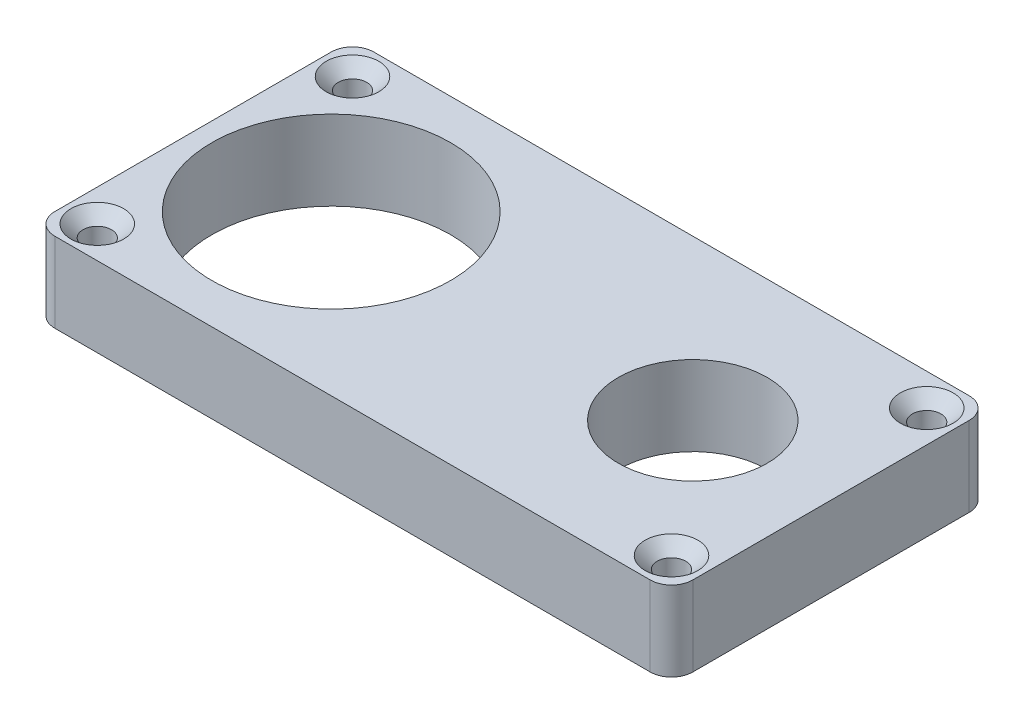
ISO-10303-21;
HEADER;
FILE_DESCRIPTION(('STEP AP214'),'2;1');
FILE_NAME('part.step','',(''),(''),'','','');
FILE_SCHEMA(('AUTOMOTIVE_DESIGN { 1 0 10303 214 1 1 1 1 }'));
ENDSEC;
DATA;
#1=APPLICATION_CONTEXT('core data for automotive mechanical design processes');
#2=APPLICATION_PROTOCOL_DEFINITION('international standard','automotive_design',2000,#1);
#3=PRODUCT_CONTEXT('',#1,'mechanical');
#4=PRODUCT('Part','Part','',(#3));
#5=PRODUCT_RELATED_PRODUCT_CATEGORY('part','',(#4));
#6=PRODUCT_DEFINITION_FORMATION('','',#4);
#7=PRODUCT_DEFINITION_CONTEXT('part definition',#1,'design');
#8=PRODUCT_DEFINITION('design','',#6,#7);
#9=PRODUCT_DEFINITION_SHAPE('','',#8);
#10=(LENGTH_UNIT() NAMED_UNIT(*) SI_UNIT(.MILLI.,.METRE.));
#11=(NAMED_UNIT(*) PLANE_ANGLE_UNIT() SI_UNIT($,.RADIAN.));
#12=(NAMED_UNIT(*) SI_UNIT($,.STERADIAN.) SOLID_ANGLE_UNIT());
#13=UNCERTAINTY_MEASURE_WITH_UNIT(LENGTH_MEASURE(1.E-05),#10,'distance_accuracy_value','');
#14=(GEOMETRIC_REPRESENTATION_CONTEXT(3) GLOBAL_UNCERTAINTY_ASSIGNED_CONTEXT((#13)) GLOBAL_UNIT_ASSIGNED_CONTEXT((#10,
#11,#12)) REPRESENTATION_CONTEXT('',''));
#15=CARTESIAN_POINT('',(0.,0.,0.));
#16=DIRECTION('',(0.,0.,1.));
#17=DIRECTION('',(1.,0.,0.));
#18=AXIS2_PLACEMENT_3D('',#15,#16,#17);
#19=CARTESIAN_POINT('',(-35.56,9.525,-16.51));
#20=DIRECTION('',(0.,-1.,0.));
#21=DIRECTION('',(0.,0.,-1.));
#22=AXIS2_PLACEMENT_3D('',#19,#20,#21);
#23=CYLINDRICAL_SURFACE('',#22,2.54);
#24=CARTESIAN_POINT('',(-35.56,0.,-16.51));
#25=DIRECTION('',(0.,-1.,0.));
#26=DIRECTION('',(0.,0.,-1.));
#27=AXIS2_PLACEMENT_3D('',#24,#25,#26);
#28=CIRCLE('',#27,2.54);
#29=CARTESIAN_POINT('',(-38.1,0.,-16.51));
#30=VERTEX_POINT('',#29);
#31=CARTESIAN_POINT('',(-35.56,0.,-19.05));
#32=VERTEX_POINT('',#31);
#33=EDGE_CURVE('E130',#30,#32,#28,.T.);
#34=ORIENTED_EDGE('',*,*,#33,.F.);
#35=DIRECTION('',(0.,-1.,0.));
#36=VECTOR('',#35,1.);
#37=CARTESIAN_POINT('',(-38.1,9.525,-16.51));
#38=LINE('',#37,#36);
#39=CARTESIAN_POINT('',(-38.1,9.525,-16.51));
#40=VERTEX_POINT('',#39);
#41=EDGE_CURVE('E11',#40,#30,#38,.T.);
#42=ORIENTED_EDGE('',*,*,#41,.F.);
#43=CARTESIAN_POINT('',(-35.56,9.525,-16.51));
#44=DIRECTION('',(0.,-1.,0.));
#45=DIRECTION('',(0.,0.,-1.));
#46=AXIS2_PLACEMENT_3D('',#43,#44,#45);
#47=CIRCLE('',#46,2.54);
#48=CARTESIAN_POINT('',(-35.56,9.525,-19.05));
#49=VERTEX_POINT('',#48);
#50=EDGE_CURVE('E151',#40,#49,#47,.T.);
#51=ORIENTED_EDGE('',*,*,#50,.T.);
#52=DIRECTION('',(0.,-1.,0.));
#53=VECTOR('',#52,1.);
#54=CARTESIAN_POINT('',(-35.56,9.525,-19.05));
#55=LINE('',#54,#53);
#56=EDGE_CURVE('E88',#49,#32,#55,.T.);
#57=ORIENTED_EDGE('',*,*,#56,.T.);
#58=EDGE_LOOP('',(#34,#42,#51,#57));
#59=FACE_BOUND('',#58,.T.);
#60=ADVANCED_FACE('F32',(#59),#23,.T.);
#61=CARTESIAN_POINT('',(-38.1,9.525,16.51));
#62=DIRECTION('',(-1.,0.,0.));
#63=DIRECTION('',(0.,0.,1.));
#64=AXIS2_PLACEMENT_3D('',#61,#62,#63);
#65=PLANE('',#64);
#66=DIRECTION('',(0.,0.,-1.));
#67=VECTOR('',#66,1.);
#68=CARTESIAN_POINT('',(-38.1,0.,16.51));
#69=LINE('',#68,#67);
#70=CARTESIAN_POINT('',(-38.1,0.,16.51));
#71=VERTEX_POINT('',#70);
#72=EDGE_CURVE('E149',#71,#30,#69,.T.);
#73=ORIENTED_EDGE('',*,*,#72,.F.);
#74=DIRECTION('',(0.,-1.,0.));
#75=VECTOR('',#74,1.);
#76=CARTESIAN_POINT('',(-38.1,9.525,16.51));
#77=LINE('',#76,#75);
#78=CARTESIAN_POINT('',(-38.1,9.525,16.51));
#79=VERTEX_POINT('',#78);
#80=EDGE_CURVE('E41',#79,#71,#77,.T.);
#81=ORIENTED_EDGE('',*,*,#80,.F.);
#82=DIRECTION('',(0.,0.,-1.));
#83=VECTOR('',#82,1.);
#84=CARTESIAN_POINT('',(-38.1,9.525,16.51));
#85=LINE('',#84,#83);
#86=EDGE_CURVE('E120',#79,#40,#85,.T.);
#87=ORIENTED_EDGE('',*,*,#86,.T.);
#88=ORIENTED_EDGE('',*,*,#41,.T.);
#89=EDGE_LOOP('',(#73,#81,#87,#88));
#90=FACE_BOUND('',#89,.T.);
#91=ADVANCED_FACE('F222',(#90),#65,.T.);
#92=CARTESIAN_POINT('',(-35.56,9.525,16.51));
#93=DIRECTION('',(0.,-1.,0.));
#94=DIRECTION('',(0.,0.,-1.));
#95=AXIS2_PLACEMENT_3D('',#92,#93,#94);
#96=CYLINDRICAL_SURFACE('',#95,2.54);
#97=CARTESIAN_POINT('',(-35.56,0.,16.51));
#98=DIRECTION('',(0.,-1.,0.));
#99=DIRECTION('',(0.,0.,-1.));
#100=AXIS2_PLACEMENT_3D('',#97,#98,#99);
#101=CIRCLE('',#100,2.54);
#102=CARTESIAN_POINT('',(-35.56,0.,19.05));
#103=VERTEX_POINT('',#102);
#104=EDGE_CURVE('E107',#103,#71,#101,.T.);
#105=ORIENTED_EDGE('',*,*,#104,.F.);
#106=DIRECTION('',(0.,-1.,0.));
#107=VECTOR('',#106,1.);
#108=CARTESIAN_POINT('',(-35.56,9.525,19.05));
#109=LINE('',#108,#107);
#110=CARTESIAN_POINT('',(-35.56,9.525,19.05));
#111=VERTEX_POINT('',#110);
#112=EDGE_CURVE('E102',#111,#103,#109,.T.);
#113=ORIENTED_EDGE('',*,*,#112,.F.);
#114=CARTESIAN_POINT('',(-35.56,9.525,16.51));
#115=DIRECTION('',(0.,-1.,0.));
#116=DIRECTION('',(0.,0.,-1.));
#117=AXIS2_PLACEMENT_3D('',#114,#115,#116);
#118=CIRCLE('',#117,2.54);
#119=EDGE_CURVE('E105',#111,#79,#118,.T.);
#120=ORIENTED_EDGE('',*,*,#119,.T.);
#121=ORIENTED_EDGE('',*,*,#80,.T.);
#122=EDGE_LOOP('',(#105,#113,#120,#121));
#123=FACE_BOUND('',#122,.T.);
#124=ADVANCED_FACE('F104',(#123),#96,.T.);
#125=CARTESIAN_POINT('',(35.56,9.525,19.05));
#126=DIRECTION('',(0.,0.,1.));
#127=DIRECTION('',(1.,0.,0.));
#128=AXIS2_PLACEMENT_3D('',#125,#126,#127);
#129=PLANE('',#128);
#130=DIRECTION('',(-1.,0.,0.));
#131=VECTOR('',#130,1.);
#132=CARTESIAN_POINT('',(35.56,0.,19.05));
#133=LINE('',#132,#131);
#134=CARTESIAN_POINT('',(35.56,0.,19.05));
#135=VERTEX_POINT('',#134);
#136=EDGE_CURVE('E146',#135,#103,#133,.T.);
#137=ORIENTED_EDGE('',*,*,#136,.F.);
#138=DIRECTION('',(0.,-1.,0.));
#139=VECTOR('',#138,1.);
#140=CARTESIAN_POINT('',(35.56,9.525,19.05));
#141=LINE('',#140,#139);
#142=CARTESIAN_POINT('',(35.56,9.525,19.05));
#143=VERTEX_POINT('',#142);
#144=EDGE_CURVE('E112',#143,#135,#141,.T.);
#145=ORIENTED_EDGE('',*,*,#144,.F.);
#146=DIRECTION('',(-1.,0.,0.));
#147=VECTOR('',#146,1.);
#148=CARTESIAN_POINT('',(35.56,9.525,19.05));
#149=LINE('',#148,#147);
#150=EDGE_CURVE('E118',#143,#111,#149,.T.);
#151=ORIENTED_EDGE('',*,*,#150,.T.);
#152=ORIENTED_EDGE('',*,*,#112,.T.);
#153=EDGE_LOOP('',(#137,#145,#151,#152));
#154=FACE_BOUND('',#153,.T.);
#155=ADVANCED_FACE('F122',(#154),#129,.T.);
#156=CARTESIAN_POINT('',(35.56,9.525,16.51));
#157=DIRECTION('',(0.,-1.,0.));
#158=DIRECTION('',(0.,0.,-1.));
#159=AXIS2_PLACEMENT_3D('',#156,#157,#158);
#160=CYLINDRICAL_SURFACE('',#159,2.54);
#161=CARTESIAN_POINT('',(35.56,0.,16.51));
#162=DIRECTION('',(0.,-1.,0.));
#163=DIRECTION('',(0.,0.,-1.));
#164=AXIS2_PLACEMENT_3D('',#161,#162,#163);
#165=CIRCLE('',#164,2.54);
#166=CARTESIAN_POINT('',(38.1,0.,16.51));
#167=VERTEX_POINT('',#166);
#168=EDGE_CURVE('E143',#167,#135,#165,.T.);
#169=ORIENTED_EDGE('',*,*,#168,.F.);
#170=DIRECTION('',(0.,-1.,0.));
#171=VECTOR('',#170,1.);
#172=CARTESIAN_POINT('',(38.1,9.525,16.51));
#173=LINE('',#172,#171);
#174=CARTESIAN_POINT('',(38.1,9.525,16.51));
#175=VERTEX_POINT('',#174);
#176=EDGE_CURVE('E155',#175,#167,#173,.T.);
#177=ORIENTED_EDGE('',*,*,#176,.F.);
#178=CARTESIAN_POINT('',(35.56,9.525,16.51));
#179=DIRECTION('',(0.,-1.,0.));
#180=DIRECTION('',(0.,0.,-1.));
#181=AXIS2_PLACEMENT_3D('',#178,#179,#180);
#182=CIRCLE('',#181,2.54);
#183=EDGE_CURVE('E123',#175,#143,#182,.T.);
#184=ORIENTED_EDGE('',*,*,#183,.T.);
#185=ORIENTED_EDGE('',*,*,#144,.T.);
#186=EDGE_LOOP('',(#169,#177,#184,#185));
#187=FACE_BOUND('',#186,.T.);
#188=ADVANCED_FACE('F235',(#187),#160,.T.);
#189=CARTESIAN_POINT('',(38.1,9.525,-16.51));
#190=DIRECTION('',(1.,0.,0.));
#191=DIRECTION('',(0.,0.,-1.));
#192=AXIS2_PLACEMENT_3D('',#189,#190,#191);
#193=PLANE('',#192);
#194=DIRECTION('',(0.,0.,1.));
#195=VECTOR('',#194,1.);
#196=CARTESIAN_POINT('',(38.1,0.,-16.51));
#197=LINE('',#196,#195);
#198=CARTESIAN_POINT('',(38.1,0.,-16.51));
#199=VERTEX_POINT('',#198);
#200=EDGE_CURVE('E140',#199,#167,#197,.T.);
#201=ORIENTED_EDGE('',*,*,#200,.F.);
#202=DIRECTION('',(0.,-1.,0.));
#203=VECTOR('',#202,1.);
#204=CARTESIAN_POINT('',(38.1,9.525,-16.51));
#205=LINE('',#204,#203);
#206=CARTESIAN_POINT('',(38.1,9.525,-16.51));
#207=VERTEX_POINT('',#206);
#208=EDGE_CURVE('E157',#207,#199,#205,.T.);
#209=ORIENTED_EDGE('',*,*,#208,.F.);
#210=DIRECTION('',(0.,0.,1.));
#211=VECTOR('',#210,1.);
#212=CARTESIAN_POINT('',(38.1,9.525,-16.51));
#213=LINE('',#212,#211);
#214=EDGE_CURVE('E125',#207,#175,#213,.T.);
#215=ORIENTED_EDGE('',*,*,#214,.T.);
#216=ORIENTED_EDGE('',*,*,#176,.T.);
#217=EDGE_LOOP('',(#201,#209,#215,#216));
#218=FACE_BOUND('',#217,.T.);
#219=ADVANCED_FACE('F213',(#218),#193,.T.);
#220=CARTESIAN_POINT('',(35.56,9.525,-16.51));
#221=DIRECTION('',(0.,-1.,0.));
#222=DIRECTION('',(0.,0.,-1.));
#223=AXIS2_PLACEMENT_3D('',#220,#221,#222);
#224=CYLINDRICAL_SURFACE('',#223,2.54);
#225=CARTESIAN_POINT('',(35.56,0.,-16.51));
#226=DIRECTION('',(0.,-1.,0.));
#227=DIRECTION('',(0.,0.,-1.));
#228=AXIS2_PLACEMENT_3D('',#225,#226,#227);
#229=CIRCLE('',#228,2.54);
#230=CARTESIAN_POINT('',(35.56,0.,-19.05));
#231=VERTEX_POINT('',#230);
#232=EDGE_CURVE('E137',#231,#199,#229,.T.);
#233=ORIENTED_EDGE('',*,*,#232,.F.);
#234=DIRECTION('',(0.,-1.,0.));
#235=VECTOR('',#234,1.);
#236=CARTESIAN_POINT('',(35.56,9.525,-19.05));
#237=LINE('',#236,#235);
#238=CARTESIAN_POINT('',(35.56,9.525,-19.05));
#239=VERTEX_POINT('',#238);
#240=EDGE_CURVE('E159',#239,#231,#237,.T.);
#241=ORIENTED_EDGE('',*,*,#240,.F.);
#242=CARTESIAN_POINT('',(35.56,9.525,-16.51));
#243=DIRECTION('',(0.,-1.,0.));
#244=DIRECTION('',(0.,0.,-1.));
#245=AXIS2_PLACEMENT_3D('',#242,#243,#244);
#246=CIRCLE('',#245,2.54);
#247=EDGE_CURVE('E207',#239,#207,#246,.T.);
#248=ORIENTED_EDGE('',*,*,#247,.T.);
#249=ORIENTED_EDGE('',*,*,#208,.T.);
#250=EDGE_LOOP('',(#233,#241,#248,#249));
#251=FACE_BOUND('',#250,.T.);
#252=ADVANCED_FACE('F218',(#251),#224,.T.);
#253=CARTESIAN_POINT('',(-35.56,9.525,-19.05));
#254=DIRECTION('',(0.,0.,-1.));
#255=DIRECTION('',(-1.,0.,0.));
#256=AXIS2_PLACEMENT_3D('',#253,#254,#255);
#257=PLANE('',#256);
#258=DIRECTION('',(1.,0.,0.));
#259=VECTOR('',#258,1.);
#260=CARTESIAN_POINT('',(-35.56,0.,-19.05));
#261=LINE('',#260,#259);
#262=EDGE_CURVE('E133',#32,#231,#261,.T.);
#263=ORIENTED_EDGE('',*,*,#262,.F.);
#264=ORIENTED_EDGE('',*,*,#56,.F.);
#265=DIRECTION('',(1.,0.,0.));
#266=VECTOR('',#265,1.);
#267=CARTESIAN_POINT('',(-35.56,9.525,-19.05));
#268=LINE('',#267,#266);
#269=EDGE_CURVE('E205',#49,#239,#268,.T.);
#270=ORIENTED_EDGE('',*,*,#269,.T.);
#271=ORIENTED_EDGE('',*,*,#240,.T.);
#272=EDGE_LOOP('',(#263,#264,#270,#271));
#273=FACE_BOUND('',#272,.T.);
#274=ADVANCED_FACE('F219',(#273),#257,.T.);
#275=CARTESIAN_POINT('',(-35.56,9.525,-16.51));
#276=DIRECTION('',(0.,-1.,0.));
#277=DIRECTION('',(0.,0.,-1.));
#278=AXIS2_PLACEMENT_3D('',#275,#276,#277);
#279=PLANE('',#278);
#280=CARTESIAN_POINT('',(-34.29,9.525,-15.24));
#281=DIRECTION('',(0.,1.,0.));
#282=DIRECTION('',(0.,0.,1.));
#283=AXIS2_PLACEMENT_3D('',#280,#281,#282);
#284=CIRCLE('',#283,3.15);
#285=CARTESIAN_POINT('',(-34.29,9.525,-12.09));
#286=VERTEX_POINT('',#285);
#287=EDGE_CURVE('E299',#286,#286,#284,.T.);
#288=ORIENTED_EDGE('',*,*,#287,.F.);
#289=EDGE_LOOP('',(#288));
#290=FACE_BOUND('',#289,.T.);
#291=CARTESIAN_POINT('',(-34.29,9.525,15.24));
#292=DIRECTION('',(0.,1.,0.));
#293=DIRECTION('',(0.,0.,1.));
#294=AXIS2_PLACEMENT_3D('',#291,#292,#293);
#295=CIRCLE('',#294,3.15);
#296=CARTESIAN_POINT('',(-34.29,9.525,18.39));
#297=VERTEX_POINT('',#296);
#298=EDGE_CURVE('E180',#297,#297,#295,.T.);
#299=ORIENTED_EDGE('',*,*,#298,.F.);
#300=EDGE_LOOP('',(#299));
#301=FACE_BOUND('',#300,.T.);
#302=CARTESIAN_POINT('',(34.29,9.525,15.24));
#303=DIRECTION('',(0.,1.,0.));
#304=DIRECTION('',(0.,0.,1.));
#305=AXIS2_PLACEMENT_3D('',#302,#303,#304);
#306=CIRCLE('',#305,3.15);
#307=CARTESIAN_POINT('',(34.29,9.525,18.39));
#308=VERTEX_POINT('',#307);
#309=EDGE_CURVE('E173',#308,#308,#306,.T.);
#310=ORIENTED_EDGE('',*,*,#309,.F.);
#311=EDGE_LOOP('',(#310));
#312=FACE_BOUND('',#311,.T.);
#313=CARTESIAN_POINT('',(34.29,9.525,-15.24));
#314=DIRECTION('',(0.,1.,0.));
#315=DIRECTION('',(0.,0.,1.));
#316=AXIS2_PLACEMENT_3D('',#313,#314,#315);
#317=CIRCLE('',#316,3.15);
#318=CARTESIAN_POINT('',(34.29,9.525,-12.09));
#319=VERTEX_POINT('',#318);
#320=EDGE_CURVE('E169',#319,#319,#317,.T.);
#321=ORIENTED_EDGE('',*,*,#320,.F.);
#322=EDGE_LOOP('',(#321));
#323=FACE_BOUND('',#322,.T.);
#324=CARTESIAN_POINT('',(-21.59,9.525,0.));
#325=DIRECTION('',(0.,-1.,0.));
#326=DIRECTION('',(0.,0.,1.));
#327=AXIS2_PLACEMENT_3D('',#324,#325,#326);
#328=CIRCLE('',#327,14.265);
#329=CARTESIAN_POINT('',(-21.59,9.525,-14.265));
#330=VERTEX_POINT('',#329);
#331=EDGE_CURVE('E194',#330,#330,#328,.T.);
#332=ORIENTED_EDGE('',*,*,#331,.T.);
#333=EDGE_LOOP('',(#332));
#334=FACE_BOUND('',#333,.T.);
#335=CARTESIAN_POINT('',(21.59,9.525,0.));
#336=DIRECTION('',(0.,-1.,0.));
#337=DIRECTION('',(0.,0.,1.));
#338=AXIS2_PLACEMENT_3D('',#335,#336,#337);
#339=CIRCLE('',#338,8.89);
#340=CARTESIAN_POINT('',(21.59,9.525,-8.89));
#341=VERTEX_POINT('',#340);
#342=EDGE_CURVE('E134',#341,#341,#339,.T.);
#343=ORIENTED_EDGE('',*,*,#342,.T.);
#344=EDGE_LOOP('',(#343));
#345=FACE_BOUND('',#344,.T.);
#346=ORIENTED_EDGE('',*,*,#50,.F.);
#347=ORIENTED_EDGE('',*,*,#86,.F.);
#348=ORIENTED_EDGE('',*,*,#119,.F.);
#349=ORIENTED_EDGE('',*,*,#150,.F.);
#350=ORIENTED_EDGE('',*,*,#183,.F.);
#351=ORIENTED_EDGE('',*,*,#214,.F.);
#352=ORIENTED_EDGE('',*,*,#247,.F.);
#353=ORIENTED_EDGE('',*,*,#269,.F.);
#354=EDGE_LOOP('',(#346,#347,#348,#349,#350,#351,#352,#353));
#355=FACE_BOUND('',#354,.T.);
#356=ADVANCED_FACE('F116',(#290,#301,#312,#323,#334,#345,#355),#279,.F.);
#357=CARTESIAN_POINT('',(-35.56,0.,-16.51));
#358=DIRECTION('',(0.,-1.,0.));
#359=DIRECTION('',(0.,0.,-1.));
#360=AXIS2_PLACEMENT_3D('',#357,#358,#359);
#361=PLANE('',#360);
#362=CARTESIAN_POINT('',(-34.29,0.,-15.24));
#363=DIRECTION('',(0.,-1.,0.));
#364=DIRECTION('',(0.,0.,-1.));
#365=AXIS2_PLACEMENT_3D('',#362,#363,#364);
#366=CIRCLE('',#365,1.7);
#367=CARTESIAN_POINT('',(-34.29,0.,-16.94));
#368=VERTEX_POINT('',#367);
#369=EDGE_CURVE('E35',#368,#368,#366,.T.);
#370=ORIENTED_EDGE('',*,*,#369,.F.);
#371=EDGE_LOOP('',(#370));
#372=FACE_BOUND('',#371,.T.);
#373=CARTESIAN_POINT('',(-34.29,0.,15.24));
#374=DIRECTION('',(0.,-1.,0.));
#375=DIRECTION('',(0.,0.,-1.));
#376=AXIS2_PLACEMENT_3D('',#373,#374,#375);
#377=CIRCLE('',#376,1.7);
#378=CARTESIAN_POINT('',(-34.29,0.,13.54));
#379=VERTEX_POINT('',#378);
#380=EDGE_CURVE('E171',#379,#379,#377,.T.);
#381=ORIENTED_EDGE('',*,*,#380,.F.);
#382=EDGE_LOOP('',(#381));
#383=FACE_BOUND('',#382,.T.);
#384=CARTESIAN_POINT('',(34.29,0.,15.24));
#385=DIRECTION('',(0.,-1.,0.));
#386=DIRECTION('',(0.,0.,-1.));
#387=AXIS2_PLACEMENT_3D('',#384,#385,#386);
#388=CIRCLE('',#387,1.7);
#389=CARTESIAN_POINT('',(34.29,0.,13.54));
#390=VERTEX_POINT('',#389);
#391=EDGE_CURVE('E167',#390,#390,#388,.T.);
#392=ORIENTED_EDGE('',*,*,#391,.F.);
#393=EDGE_LOOP('',(#392));
#394=FACE_BOUND('',#393,.T.);
#395=CARTESIAN_POINT('',(34.29,0.,-15.24));
#396=DIRECTION('',(0.,-1.,0.));
#397=DIRECTION('',(0.,0.,-1.));
#398=AXIS2_PLACEMENT_3D('',#395,#396,#397);
#399=CIRCLE('',#398,1.7);
#400=CARTESIAN_POINT('',(34.29,0.,-16.94));
#401=VERTEX_POINT('',#400);
#402=EDGE_CURVE('E162',#401,#401,#399,.T.);
#403=ORIENTED_EDGE('',*,*,#402,.F.);
#404=EDGE_LOOP('',(#403));
#405=FACE_BOUND('',#404,.T.);
#406=CARTESIAN_POINT('',(-21.59,0.,0.));
#407=DIRECTION('',(0.,-1.,0.));
#408=DIRECTION('',(0.,0.,1.));
#409=AXIS2_PLACEMENT_3D('',#406,#407,#408);
#410=CIRCLE('',#409,14.265);
#411=CARTESIAN_POINT('',(-21.59,0.,-14.265));
#412=VERTEX_POINT('',#411);
#413=EDGE_CURVE('E165',#412,#412,#410,.T.);
#414=ORIENTED_EDGE('',*,*,#413,.F.);
#415=EDGE_LOOP('',(#414));
#416=FACE_BOUND('',#415,.T.);
#417=CARTESIAN_POINT('',(21.59,0.,0.));
#418=DIRECTION('',(0.,-1.,0.));
#419=DIRECTION('',(0.,0.,1.));
#420=AXIS2_PLACEMENT_3D('',#417,#418,#419);
#421=CIRCLE('',#420,8.89);
#422=CARTESIAN_POINT('',(21.59,0.,-8.89));
#423=VERTEX_POINT('',#422);
#424=EDGE_CURVE('E197',#423,#423,#421,.T.);
#425=ORIENTED_EDGE('',*,*,#424,.F.);
#426=EDGE_LOOP('',(#425));
#427=FACE_BOUND('',#426,.T.);
#428=ORIENTED_EDGE('',*,*,#33,.T.);
#429=ORIENTED_EDGE('',*,*,#262,.T.);
#430=ORIENTED_EDGE('',*,*,#232,.T.);
#431=ORIENTED_EDGE('',*,*,#200,.T.);
#432=ORIENTED_EDGE('',*,*,#168,.T.);
#433=ORIENTED_EDGE('',*,*,#136,.T.);
#434=ORIENTED_EDGE('',*,*,#104,.T.);
#435=ORIENTED_EDGE('',*,*,#72,.T.);
#436=EDGE_LOOP('',(#428,#429,#430,#431,#432,#433,#434,#435));
#437=FACE_BOUND('',#436,.T.);
#438=ADVANCED_FACE('F221',(#372,#383,#394,#405,#416,#427,#437),#361,.T.);
#439=CARTESIAN_POINT('',(21.59,9.525,0.));
#440=DIRECTION('',(0.,-1.,0.));
#441=DIRECTION('',(0.,0.,-1.));
#442=AXIS2_PLACEMENT_3D('',#439,#440,#441);
#443=CYLINDRICAL_SURFACE('',#442,8.89);
#444=CARTESIAN_POINT('',(21.59,9.525,-8.89));
#445=CARTESIAN_POINT('',(21.59,9.42578125,-8.89));
#446=CARTESIAN_POINT('',(21.59,9.3265625,-8.89));
#447=CARTESIAN_POINT('',(21.59,9.128125,-8.89));
#448=CARTESIAN_POINT('',(21.59,9.02890625,-8.89));
#449=CARTESIAN_POINT('',(21.59,8.83046875,-8.89));
#450=CARTESIAN_POINT('',(21.59,8.73125,-8.89));
#451=CARTESIAN_POINT('',(21.59,8.5328125,-8.89));
#452=CARTESIAN_POINT('',(21.59,8.43359375,-8.89));
#453=CARTESIAN_POINT('',(21.59,8.23515625,-8.89));
#454=CARTESIAN_POINT('',(21.59,8.1359375,-8.89));
#455=CARTESIAN_POINT('',(21.59,7.9375,-8.89));
#456=CARTESIAN_POINT('',(21.59,7.83828125,-8.89));
#457=CARTESIAN_POINT('',(21.59,7.63984375,-8.89));
#458=CARTESIAN_POINT('',(21.59,7.540625,-8.89));
#459=CARTESIAN_POINT('',(21.59,7.3421875,-8.89));
#460=CARTESIAN_POINT('',(21.59,7.24296875,-8.89));
#461=CARTESIAN_POINT('',(21.59,7.04453125,-8.89));
#462=CARTESIAN_POINT('',(21.59,6.9453125,-8.89));
#463=CARTESIAN_POINT('',(21.59,6.746875,-8.89));
#464=CARTESIAN_POINT('',(21.59,6.64765625,-8.89));
#465=CARTESIAN_POINT('',(21.59,6.44921875,-8.89));
#466=CARTESIAN_POINT('',(21.59,6.35,-8.89));
#467=CARTESIAN_POINT('',(21.59,6.1515625,-8.89));
#468=CARTESIAN_POINT('',(21.59,6.05234375,-8.89));
#469=CARTESIAN_POINT('',(21.59,5.85390625,-8.89));
#470=CARTESIAN_POINT('',(21.59,5.7546875,-8.89));
#471=CARTESIAN_POINT('',(21.59,5.55625,-8.89));
#472=CARTESIAN_POINT('',(21.59,5.45703125,-8.89));
#473=CARTESIAN_POINT('',(21.59,5.25859375,-8.89));
#474=CARTESIAN_POINT('',(21.59,5.159375,-8.89));
#475=CARTESIAN_POINT('',(21.59,4.9609375,-8.89));
#476=CARTESIAN_POINT('',(21.59,4.86171875,-8.89));
#477=CARTESIAN_POINT('',(21.59,4.66328125,-8.89));
#478=CARTESIAN_POINT('',(21.59,4.5640625,-8.89));
#479=CARTESIAN_POINT('',(21.59,4.365625,-8.89));
#480=CARTESIAN_POINT('',(21.59,4.26640625,-8.89));
#481=CARTESIAN_POINT('',(21.59,4.06796875,-8.89));
#482=CARTESIAN_POINT('',(21.59,3.96875,-8.89));
#483=CARTESIAN_POINT('',(21.59,3.7703125,-8.89));
#484=CARTESIAN_POINT('',(21.59,3.67109375,-8.89));
#485=CARTESIAN_POINT('',(21.59,3.47265625,-8.89));
#486=CARTESIAN_POINT('',(21.59,3.3734375,-8.89));
#487=CARTESIAN_POINT('',(21.59,3.175,-8.89));
#488=CARTESIAN_POINT('',(21.59,3.07578125,-8.89));
#489=CARTESIAN_POINT('',(21.59,2.87734375,-8.89));
#490=CARTESIAN_POINT('',(21.59,2.778125,-8.89));
#491=CARTESIAN_POINT('',(21.59,2.5796875,-8.89));
#492=CARTESIAN_POINT('',(21.59,2.48046875,-8.89));
#493=CARTESIAN_POINT('',(21.59,2.28203125,-8.89));
#494=CARTESIAN_POINT('',(21.59,2.1828125,-8.89));
#495=CARTESIAN_POINT('',(21.59,1.984375,-8.89));
#496=CARTESIAN_POINT('',(21.59,1.88515625,-8.89));
#497=CARTESIAN_POINT('',(21.59,1.68671875,-8.89));
#498=CARTESIAN_POINT('',(21.59,1.5875,-8.89));
#499=CARTESIAN_POINT('',(21.59,1.3890625,-8.89));
#500=CARTESIAN_POINT('',(21.59,1.28984375,-8.89));
#501=CARTESIAN_POINT('',(21.59,1.09140625,-8.89));
#502=CARTESIAN_POINT('',(21.59,0.992187500000001,-8.89));
#503=CARTESIAN_POINT('',(21.59,0.793750000000001,-8.89));
#504=CARTESIAN_POINT('',(21.59,0.69453125,-8.89));
#505=CARTESIAN_POINT('',(21.59,0.49609375,-8.89));
#506=CARTESIAN_POINT('',(21.59,0.396875,-8.89));
#507=CARTESIAN_POINT('',(21.59,0.1984375,-8.89));
#508=CARTESIAN_POINT('',(21.59,0.0992187500000001,-8.89));
#509=CARTESIAN_POINT('',(21.59,0.,-8.89));
#510=B_SPLINE_CURVE_WITH_KNOTS('',3,(#444,#445,#446,#447,#448,#449,#450,#451,#452,#453,#454,
#455,#456,#457,#458,#459,#460,#461,#462,#463,#464,#465,#466,#467,#468,#469,#470,#471,#472,#473,
#474,#475,#476,#477,#478,#479,#480,#481,#482,#483,#484,#485,#486,#487,#488,#489,#490,#491,#492,
#493,#494,#495,#496,#497,#498,#499,#500,#501,#502,#503,#504,#505,#506,#507,#508,#509),
.UNSPECIFIED.,.F.,.F.,(4,2,2,2,2,2,2,2,2,2,2,2,2,2,2,2,2,2,2,2,2,2,2,2,2,2,2,2,2,2,2,2,4),(0.,
0.297656249999998,0.595312499999999,0.892968749999999,1.190625,1.48828125,1.7859375,2.08359375,
2.38125,2.67890625,2.9765625,3.27421875,3.571875,3.86953125,4.1671875,4.46484375,4.7625,
5.06015625,5.3578125,5.65546875,5.953125,6.25078125,6.5484375,6.84609375,7.14375,7.44140625,
7.7390625,8.03671875,8.334375,8.63203125,8.9296875,9.22734375,9.525),.UNSPECIFIED.);
#511=EDGE_CURVE('BSEAM250',#341,#423,#510,.T.);
#512=ORIENTED_EDGE('',*,*,#342,.F.);
#513=ORIENTED_EDGE('',*,*,#424,.T.);
#514=ORIENTED_EDGE('',*,*,#511,.T.);
#515=ORIENTED_EDGE('',*,*,#511,.F.);
#516=EDGE_LOOP('',(#512,#514,#513,#515));
#517=FACE_BOUND('',#516,.T.);
#518=ADVANCED_FACE('F250',(#517),#443,.F.);
#519=CARTESIAN_POINT('',(-21.59,9.525,0.));
#520=DIRECTION('',(0.,-1.,0.));
#521=DIRECTION('',(0.,0.,-1.));
#522=AXIS2_PLACEMENT_3D('',#519,#520,#521);
#523=CYLINDRICAL_SURFACE('',#522,14.265);
#524=CARTESIAN_POINT('',(-21.59,9.525,-14.265));
#525=CARTESIAN_POINT('',(-21.59,9.42578125,-14.265));
#526=CARTESIAN_POINT('',(-21.59,9.3265625,-14.265));
#527=CARTESIAN_POINT('',(-21.59,9.128125,-14.265));
#528=CARTESIAN_POINT('',(-21.59,9.02890625,-14.265));
#529=CARTESIAN_POINT('',(-21.59,8.83046875,-14.265));
#530=CARTESIAN_POINT('',(-21.59,8.73125,-14.265));
#531=CARTESIAN_POINT('',(-21.59,8.5328125,-14.265));
#532=CARTESIAN_POINT('',(-21.59,8.43359375,-14.265));
#533=CARTESIAN_POINT('',(-21.59,8.23515625,-14.265));
#534=CARTESIAN_POINT('',(-21.59,8.1359375,-14.265));
#535=CARTESIAN_POINT('',(-21.59,7.9375,-14.265));
#536=CARTESIAN_POINT('',(-21.59,7.83828125,-14.265));
#537=CARTESIAN_POINT('',(-21.59,7.63984375,-14.265));
#538=CARTESIAN_POINT('',(-21.59,7.540625,-14.265));
#539=CARTESIAN_POINT('',(-21.59,7.3421875,-14.265));
#540=CARTESIAN_POINT('',(-21.59,7.24296875,-14.265));
#541=CARTESIAN_POINT('',(-21.59,7.04453125,-14.265));
#542=CARTESIAN_POINT('',(-21.59,6.9453125,-14.265));
#543=CARTESIAN_POINT('',(-21.59,6.746875,-14.265));
#544=CARTESIAN_POINT('',(-21.59,6.64765625,-14.265));
#545=CARTESIAN_POINT('',(-21.59,6.44921875,-14.265));
#546=CARTESIAN_POINT('',(-21.59,6.35,-14.265));
#547=CARTESIAN_POINT('',(-21.59,6.1515625,-14.265));
#548=CARTESIAN_POINT('',(-21.59,6.05234375,-14.265));
#549=CARTESIAN_POINT('',(-21.59,5.85390625,-14.265));
#550=CARTESIAN_POINT('',(-21.59,5.7546875,-14.265));
#551=CARTESIAN_POINT('',(-21.59,5.55625,-14.265));
#552=CARTESIAN_POINT('',(-21.59,5.45703125,-14.265));
#553=CARTESIAN_POINT('',(-21.59,5.25859375,-14.265));
#554=CARTESIAN_POINT('',(-21.59,5.159375,-14.265));
#555=CARTESIAN_POINT('',(-21.59,4.9609375,-14.265));
#556=CARTESIAN_POINT('',(-21.59,4.86171875,-14.265));
#557=CARTESIAN_POINT('',(-21.59,4.66328125,-14.265));
#558=CARTESIAN_POINT('',(-21.59,4.5640625,-14.265));
#559=CARTESIAN_POINT('',(-21.59,4.365625,-14.265));
#560=CARTESIAN_POINT('',(-21.59,4.26640625,-14.265));
#561=CARTESIAN_POINT('',(-21.59,4.06796875,-14.265));
#562=CARTESIAN_POINT('',(-21.59,3.96875,-14.265));
#563=CARTESIAN_POINT('',(-21.59,3.7703125,-14.265));
#564=CARTESIAN_POINT('',(-21.59,3.67109375,-14.265));
#565=CARTESIAN_POINT('',(-21.59,3.47265625,-14.265));
#566=CARTESIAN_POINT('',(-21.59,3.3734375,-14.265));
#567=CARTESIAN_POINT('',(-21.59,3.175,-14.265));
#568=CARTESIAN_POINT('',(-21.59,3.07578125,-14.265));
#569=CARTESIAN_POINT('',(-21.59,2.87734375,-14.265));
#570=CARTESIAN_POINT('',(-21.59,2.778125,-14.265));
#571=CARTESIAN_POINT('',(-21.59,2.5796875,-14.265));
#572=CARTESIAN_POINT('',(-21.59,2.48046875,-14.265));
#573=CARTESIAN_POINT('',(-21.59,2.28203125,-14.265));
#574=CARTESIAN_POINT('',(-21.59,2.1828125,-14.265));
#575=CARTESIAN_POINT('',(-21.59,1.984375,-14.265));
#576=CARTESIAN_POINT('',(-21.59,1.88515625,-14.265));
#577=CARTESIAN_POINT('',(-21.59,1.68671875,-14.265));
#578=CARTESIAN_POINT('',(-21.59,1.5875,-14.265));
#579=CARTESIAN_POINT('',(-21.59,1.3890625,-14.265));
#580=CARTESIAN_POINT('',(-21.59,1.28984375,-14.265));
#581=CARTESIAN_POINT('',(-21.59,1.09140625,-14.265));
#582=CARTESIAN_POINT('',(-21.59,0.992187500000001,-14.265));
#583=CARTESIAN_POINT('',(-21.59,0.793750000000001,-14.265));
#584=CARTESIAN_POINT('',(-21.59,0.69453125,-14.265));
#585=CARTESIAN_POINT('',(-21.59,0.49609375,-14.265));
#586=CARTESIAN_POINT('',(-21.59,0.396875,-14.265));
#587=CARTESIAN_POINT('',(-21.59,0.1984375,-14.265));
#588=CARTESIAN_POINT('',(-21.59,0.0992187500000001,-14.265));
#589=CARTESIAN_POINT('',(-21.59,0.,-14.265));
#590=B_SPLINE_CURVE_WITH_KNOTS('',3,(#524,#525,#526,#527,#528,#529,#530,#531,#532,#533,#534,
#535,#536,#537,#538,#539,#540,#541,#542,#543,#544,#545,#546,#547,#548,#549,#550,#551,#552,#553,
#554,#555,#556,#557,#558,#559,#560,#561,#562,#563,#564,#565,#566,#567,#568,#569,#570,#571,#572,
#573,#574,#575,#576,#577,#578,#579,#580,#581,#582,#583,#584,#585,#586,#587,#588,#589),
.UNSPECIFIED.,.F.,.F.,(4,2,2,2,2,2,2,2,2,2,2,2,2,2,2,2,2,2,2,2,2,2,2,2,2,2,2,2,2,2,2,2,4),(0.,
0.297656249999998,0.595312499999999,0.892968749999999,1.190625,1.48828125,1.7859375,2.08359375,
2.38125,2.67890625,2.9765625,3.27421875,3.571875,3.86953125,4.1671875,4.46484375,4.7625,
5.06015625,5.3578125,5.65546875,5.953125,6.25078125,6.5484375,6.84609375,7.14375,7.44140625,
7.7390625,8.03671875,8.334375,8.63203125,8.9296875,9.22734375,9.525),.UNSPECIFIED.);
#591=EDGE_CURVE('BSEAM257',#330,#412,#590,.T.);
#592=ORIENTED_EDGE('',*,*,#331,.F.);
#593=ORIENTED_EDGE('',*,*,#413,.T.);
#594=ORIENTED_EDGE('',*,*,#591,.T.);
#595=ORIENTED_EDGE('',*,*,#591,.F.);
#596=EDGE_LOOP('',(#592,#594,#593,#595));
#597=FACE_BOUND('',#596,.T.);
#598=ADVANCED_FACE('F257',(#597),#523,.F.);
#599=CARTESIAN_POINT('',(34.29,9.525,-15.24));
#600=DIRECTION('',(0.,1.,0.));
#601=DIRECTION('',(0.,0.,1.));
#602=AXIS2_PLACEMENT_3D('',#599,#600,#601);
#603=CYLINDRICAL_SURFACE('',#602,1.7);
#604=ORIENTED_EDGE('',*,*,#402,.T.);
#605=EDGE_LOOP('',(#604));
#606=FACE_BOUND('',#605,.T.);
#607=CARTESIAN_POINT('',(34.29,8.075,-15.24));
#608=DIRECTION('',(0.,1.,0.));
#609=DIRECTION('',(0.,0.,1.));
#610=AXIS2_PLACEMENT_3D('',#607,#608,#609);
#611=CIRCLE('',#610,1.7);
#612=CARTESIAN_POINT('',(34.29,8.075,-13.54));
#613=VERTEX_POINT('',#612);
#614=EDGE_CURVE('E166',#613,#613,#611,.T.);
#615=ORIENTED_EDGE('',*,*,#614,.T.);
#616=EDGE_LOOP('',(#615));
#617=FACE_BOUND('',#616,.T.);
#618=ADVANCED_FACE('F261',(#606,#617),#603,.F.);
#619=CARTESIAN_POINT('',(34.29,9.525,-15.24));
#620=DIRECTION('',(0.,1.,0.));
#621=DIRECTION('',(0.,0.,1.));
#622=AXIS2_PLACEMENT_3D('',#619,#620,#621);
#623=CONICAL_SURFACE('',#622,3.15,0.785398163397448);
#624=ORIENTED_EDGE('',*,*,#614,.F.);
#625=EDGE_LOOP('',(#624));
#626=FACE_BOUND('',#625,.T.);
#627=ORIENTED_EDGE('',*,*,#320,.T.);
#628=EDGE_LOOP('',(#627));
#629=FACE_BOUND('',#628,.T.);
#630=ADVANCED_FACE('F265',(#626,#629),#623,.F.);
#631=CARTESIAN_POINT('',(34.29,9.525,15.24));
#632=DIRECTION('',(0.,1.,0.));
#633=DIRECTION('',(0.,0.,1.));
#634=AXIS2_PLACEMENT_3D('',#631,#632,#633);
#635=CYLINDRICAL_SURFACE('',#634,1.7);
#636=ORIENTED_EDGE('',*,*,#391,.T.);
#637=EDGE_LOOP('',(#636));
#638=FACE_BOUND('',#637,.T.);
#639=CARTESIAN_POINT('',(34.29,8.075,15.24));
#640=DIRECTION('',(0.,1.,0.));
#641=DIRECTION('',(0.,0.,1.));
#642=AXIS2_PLACEMENT_3D('',#639,#640,#641);
#643=CIRCLE('',#642,1.7);
#644=CARTESIAN_POINT('',(34.29,8.075,16.94));
#645=VERTEX_POINT('',#644);
#646=EDGE_CURVE('E170',#645,#645,#643,.T.);
#647=ORIENTED_EDGE('',*,*,#646,.T.);
#648=EDGE_LOOP('',(#647));
#649=FACE_BOUND('',#648,.T.);
#650=ADVANCED_FACE('F269',(#638,#649),#635,.F.);
#651=CARTESIAN_POINT('',(34.29,9.525,15.24));
#652=DIRECTION('',(0.,1.,0.));
#653=DIRECTION('',(0.,0.,1.));
#654=AXIS2_PLACEMENT_3D('',#651,#652,#653);
#655=CONICAL_SURFACE('',#654,3.15,0.785398163397448);
#656=ORIENTED_EDGE('',*,*,#646,.F.);
#657=EDGE_LOOP('',(#656));
#658=FACE_BOUND('',#657,.T.);
#659=ORIENTED_EDGE('',*,*,#309,.T.);
#660=EDGE_LOOP('',(#659));
#661=FACE_BOUND('',#660,.T.);
#662=ADVANCED_FACE('F273',(#658,#661),#655,.F.);
#663=CARTESIAN_POINT('',(-34.29,9.525,15.24));
#664=DIRECTION('',(0.,1.,0.));
#665=DIRECTION('',(0.,0.,1.));
#666=AXIS2_PLACEMENT_3D('',#663,#664,#665);
#667=CYLINDRICAL_SURFACE('',#666,1.7);
#668=ORIENTED_EDGE('',*,*,#380,.T.);
#669=EDGE_LOOP('',(#668));
#670=FACE_BOUND('',#669,.T.);
#671=CARTESIAN_POINT('',(-34.29,8.075,15.24));
#672=DIRECTION('',(0.,1.,0.));
#673=DIRECTION('',(0.,0.,1.));
#674=AXIS2_PLACEMENT_3D('',#671,#672,#673);
#675=CIRCLE('',#674,1.7);
#676=CARTESIAN_POINT('',(-34.29,8.075,16.94));
#677=VERTEX_POINT('',#676);
#678=EDGE_CURVE('E174',#677,#677,#675,.T.);
#679=ORIENTED_EDGE('',*,*,#678,.T.);
#680=EDGE_LOOP('',(#679));
#681=FACE_BOUND('',#680,.T.);
#682=ADVANCED_FACE('F277',(#670,#681),#667,.F.);
#683=CARTESIAN_POINT('',(-34.29,9.525,15.24));
#684=DIRECTION('',(0.,1.,0.));
#685=DIRECTION('',(0.,0.,1.));
#686=AXIS2_PLACEMENT_3D('',#683,#684,#685);
#687=CONICAL_SURFACE('',#686,3.15,0.785398163397448);
#688=ORIENTED_EDGE('',*,*,#678,.F.);
#689=EDGE_LOOP('',(#688));
#690=FACE_BOUND('',#689,.T.);
#691=ORIENTED_EDGE('',*,*,#298,.T.);
#692=EDGE_LOOP('',(#691));
#693=FACE_BOUND('',#692,.T.);
#694=ADVANCED_FACE('F281',(#690,#693),#687,.F.);
#695=CARTESIAN_POINT('',(-34.29,9.525,-15.24));
#696=DIRECTION('',(0.,1.,0.));
#697=DIRECTION('',(0.,0.,1.));
#698=AXIS2_PLACEMENT_3D('',#695,#696,#697);
#699=CYLINDRICAL_SURFACE('',#698,1.7);
#700=ORIENTED_EDGE('',*,*,#369,.T.);
#701=EDGE_LOOP('',(#700));
#702=FACE_BOUND('',#701,.T.);
#703=CARTESIAN_POINT('',(-34.29,8.075,-15.24));
#704=DIRECTION('',(0.,1.,0.));
#705=DIRECTION('',(0.,0.,1.));
#706=AXIS2_PLACEMENT_3D('',#703,#704,#705);
#707=CIRCLE('',#706,1.7);
#708=CARTESIAN_POINT('',(-34.29,8.075,-13.54));
#709=VERTEX_POINT('',#708);
#710=EDGE_CURVE('E297',#709,#709,#707,.T.);
#711=ORIENTED_EDGE('',*,*,#710,.T.);
#712=EDGE_LOOP('',(#711));
#713=FACE_BOUND('',#712,.T.);
#714=ADVANCED_FACE('F284',(#702,#713),#699,.F.);
#715=CARTESIAN_POINT('',(-34.29,9.525,-15.24));
#716=DIRECTION('',(0.,1.,0.));
#717=DIRECTION('',(0.,0.,1.));
#718=AXIS2_PLACEMENT_3D('',#715,#716,#717);
#719=CONICAL_SURFACE('',#718,3.15,0.785398163397448);
#720=ORIENTED_EDGE('',*,*,#710,.F.);
#721=EDGE_LOOP('',(#720));
#722=FACE_BOUND('',#721,.T.);
#723=ORIENTED_EDGE('',*,*,#287,.T.);
#724=EDGE_LOOP('',(#723));
#725=FACE_BOUND('',#724,.T.);
#726=ADVANCED_FACE('F288',(#722,#725),#719,.F.);
#727=CLOSED_SHELL('',(#60,#91,#124,#155,#188,#219,#252,#274,#356,#438,#518,#598,#618,#630,#650,
#662,#682,#694,#714,#726));
#728=MANIFOLD_SOLID_BREP('B2',#727);
#729=ADVANCED_BREP_SHAPE_REPRESENTATION('',(#18,#728),#14);
#730=SHAPE_DEFINITION_REPRESENTATION(#9,#729);
ENDSEC;
END-ISO-10303-21;
